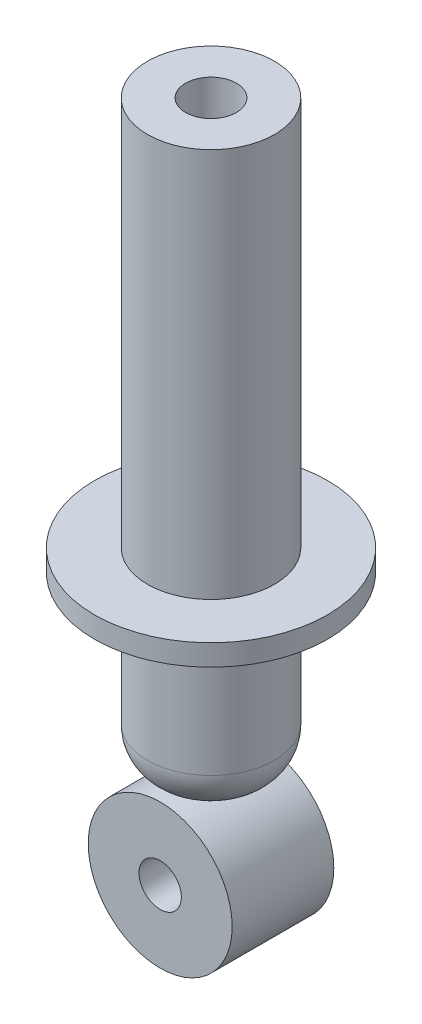
ISO-10303-21;
HEADER;
FILE_DESCRIPTION(('STEP AP214'),'2;1');
FILE_NAME('part.step','',(''),(''),'','','');
FILE_SCHEMA(('AUTOMOTIVE_DESIGN { 1 0 10303 214 1 1 1 1 }'));
ENDSEC;
DATA;
#1=APPLICATION_CONTEXT('core data for automotive mechanical design processes');
#2=APPLICATION_PROTOCOL_DEFINITION('international standard','automotive_design',2000,#1);
#3=PRODUCT_CONTEXT('',#1,'mechanical');
#4=PRODUCT('Part','Part','',(#3));
#5=PRODUCT_RELATED_PRODUCT_CATEGORY('part','',(#4));
#6=PRODUCT_DEFINITION_FORMATION('','',#4);
#7=PRODUCT_DEFINITION_CONTEXT('part definition',#1,'design');
#8=PRODUCT_DEFINITION('design','',#6,#7);
#9=PRODUCT_DEFINITION_SHAPE('','',#8);
#10=(LENGTH_UNIT() NAMED_UNIT(*) SI_UNIT(.MILLI.,.METRE.));
#11=(NAMED_UNIT(*) PLANE_ANGLE_UNIT() SI_UNIT($,.RADIAN.));
#12=(NAMED_UNIT(*) SI_UNIT($,.STERADIAN.) SOLID_ANGLE_UNIT());
#13=UNCERTAINTY_MEASURE_WITH_UNIT(LENGTH_MEASURE(1.E-05),#10,'distance_accuracy_value','');
#14=(GEOMETRIC_REPRESENTATION_CONTEXT(3) GLOBAL_UNCERTAINTY_ASSIGNED_CONTEXT((#13)) GLOBAL_UNIT_ASSIGNED_CONTEXT((#10,
#11,#12)) REPRESENTATION_CONTEXT('',''));
#15=CARTESIAN_POINT('',(0.,0.,0.));
#16=DIRECTION('',(0.,0.,1.));
#17=DIRECTION('',(1.,0.,0.));
#18=AXIS2_PLACEMENT_3D('',#15,#16,#17);
#19=CARTESIAN_POINT('',(0.,-17.,12.));
#20=DIRECTION('',(0.,0.,1.));
#21=DIRECTION('',(1.,0.,0.));
#22=AXIS2_PLACEMENT_3D('',#19,#20,#21);
#23=PLANE('',#22);
#24=CARTESIAN_POINT('',(0.,-17.,12.));
#25=DIRECTION('',(0.,0.,1.));
#26=DIRECTION('',(1.,0.,0.));
#27=AXIS2_PLACEMENT_3D('',#24,#25,#26);
#28=CIRCLE('',#27,17.);
#29=CARTESIAN_POINT('',(17.,-17.,12.));
#30=VERTEX_POINT('',#29);
#31=EDGE_CURVE('E13',#30,#30,#28,.T.);
#32=ORIENTED_EDGE('',*,*,#31,.T.);
#33=EDGE_LOOP('',(#32));
#34=FACE_BOUND('',#33,.T.);
#35=CARTESIAN_POINT('',(0.,-17.,12.));
#36=DIRECTION('',(0.,0.,1.));
#37=DIRECTION('',(1.,0.,0.));
#38=AXIS2_PLACEMENT_3D('',#35,#36,#37);
#39=CIRCLE('',#38,5.);
#40=CARTESIAN_POINT('',(5.,-17.,12.));
#41=VERTEX_POINT('',#40);
#42=EDGE_CURVE('E63',#41,#41,#39,.T.);
#43=ORIENTED_EDGE('',*,*,#42,.F.);
#44=EDGE_LOOP('',(#43));
#45=FACE_BOUND('',#44,.T.);
#46=ADVANCED_FACE('F52',(#34,#45),#23,.T.);
#47=CARTESIAN_POINT('',(0.,-17.,-12.));
#48=DIRECTION('',(0.,0.,1.));
#49=DIRECTION('',(1.,0.,0.));
#50=AXIS2_PLACEMENT_3D('',#47,#48,#49);
#51=PLANE('',#50);
#52=CARTESIAN_POINT('',(0.,-17.,-12.));
#53=DIRECTION('',(0.,0.,1.));
#54=DIRECTION('',(1.,0.,0.));
#55=AXIS2_PLACEMENT_3D('',#52,#53,#54);
#56=CIRCLE('',#55,17.);
#57=CARTESIAN_POINT('',(17.,-17.,-12.));
#58=VERTEX_POINT('',#57);
#59=EDGE_CURVE('E56',#58,#58,#56,.T.);
#60=ORIENTED_EDGE('',*,*,#59,.F.);
#61=EDGE_LOOP('',(#60));
#62=FACE_BOUND('',#61,.T.);
#63=CARTESIAN_POINT('',(0.,-17.,-12.));
#64=DIRECTION('',(0.,0.,1.));
#65=DIRECTION('',(1.,0.,0.));
#66=AXIS2_PLACEMENT_3D('',#63,#64,#65);
#67=CIRCLE('',#66,5.);
#68=CARTESIAN_POINT('',(5.,-17.,-12.));
#69=VERTEX_POINT('',#68);
#70=EDGE_CURVE('E65',#69,#69,#67,.T.);
#71=ORIENTED_EDGE('',*,*,#70,.T.);
#72=EDGE_LOOP('',(#71));
#73=FACE_BOUND('',#72,.T.);
#74=ADVANCED_FACE('F75',(#62,#73),#51,.F.);
#75=CARTESIAN_POINT('',(0.,-17.,12.));
#76=DIRECTION('',(0.,0.,-1.));
#77=DIRECTION('',(-1.,0.,0.));
#78=AXIS2_PLACEMENT_3D('',#75,#76,#77);
#79=CYLINDRICAL_SURFACE('',#78,17.);
#80=ORIENTED_EDGE('',*,*,#31,.F.);
#81=EDGE_LOOP('',(#80));
#82=FACE_BOUND('',#81,.T.);
#83=ORIENTED_EDGE('',*,*,#59,.T.);
#84=EDGE_LOOP('',(#83));
#85=FACE_BOUND('',#84,.T.);
#86=ADVANCED_FACE('F54',(#82,#85),#79,.T.);
#87=CARTESIAN_POINT('',(0.,-17.,12.));
#88=DIRECTION('',(0.,0.,-1.));
#89=DIRECTION('',(-1.,0.,0.));
#90=AXIS2_PLACEMENT_3D('',#87,#88,#89);
#91=CYLINDRICAL_SURFACE('',#90,5.);
#92=ORIENTED_EDGE('',*,*,#42,.T.);
#93=EDGE_LOOP('',(#92));
#94=FACE_BOUND('',#93,.T.);
#95=ORIENTED_EDGE('',*,*,#70,.F.);
#96=EDGE_LOOP('',(#95));
#97=FACE_BOUND('',#96,.T.);
#98=ADVANCED_FACE('F71',(#94,#97),#91,.F.);
#99=CLOSED_SHELL('',(#46,#74,#86,#98));
#100=MANIFOLD_SOLID_BREP('B2',#99);
#101=CARTESIAN_POINT('',(0.,136.,0.));
#102=DIRECTION('',(0.,-1.,0.));
#103=DIRECTION('',(0.,0.,-1.));
#104=AXIS2_PLACEMENT_3D('',#101,#102,#103);
#105=CYLINDRICAL_SURFACE('',#104,15.);
#106=CARTESIAN_POINT('',(0.,46.,0.));
#107=DIRECTION('',(0.,1.,0.));
#108=DIRECTION('',(0.,0.,1.));
#109=AXIS2_PLACEMENT_3D('',#106,#107,#108);
#110=CIRCLE('',#109,15.);
#111=CARTESIAN_POINT('',(0.,46.,15.));
#112=VERTEX_POINT('',#111);
#113=EDGE_CURVE('E149',#112,#112,#110,.T.);
#114=ORIENTED_EDGE('',*,*,#113,.T.);
#115=EDGE_LOOP('',(#114));
#116=FACE_BOUND('',#115,.T.);
#117=CARTESIAN_POINT('',(0.,138.,0.));
#118=DIRECTION('',(0.,1.,0.));
#119=DIRECTION('',(0.,0.,1.));
#120=AXIS2_PLACEMENT_3D('',#117,#118,#119);
#121=CIRCLE('',#120,15.);
#122=CARTESIAN_POINT('',(0.,138.,15.));
#123=VERTEX_POINT('',#122);
#124=EDGE_CURVE('E134',#123,#123,#121,.T.);
#125=ORIENTED_EDGE('',*,*,#124,.F.);
#126=EDGE_LOOP('',(#125));
#127=FACE_BOUND('',#126,.T.);
#128=ADVANCED_FACE('F119',(#116,#127),#105,.T.);
#129=CARTESIAN_POINT('',(0.,138.,0.));
#130=DIRECTION('',(0.,1.,0.));
#131=DIRECTION('',(0.,0.,1.));
#132=AXIS2_PLACEMENT_3D('',#129,#130,#131);
#133=PLANE('',#132);
#134=ORIENTED_EDGE('',*,*,#124,.T.);
#135=EDGE_LOOP('',(#134));
#136=FACE_BOUND('',#135,.T.);
#137=CARTESIAN_POINT('',(0.,138.,0.));
#138=DIRECTION('',(0.,1.,0.));
#139=DIRECTION('',(0.,0.,1.));
#140=AXIS2_PLACEMENT_3D('',#137,#138,#139);
#141=CIRCLE('',#140,6.);
#142=CARTESIAN_POINT('',(0.,138.,6.));
#143=VERTEX_POINT('',#142);
#144=EDGE_CURVE('E139',#143,#143,#141,.T.);
#145=ORIENTED_EDGE('',*,*,#144,.F.);
#146=EDGE_LOOP('',(#145));
#147=FACE_BOUND('',#146,.T.);
#148=ADVANCED_FACE('F174',(#136,#147),#133,.T.);
#149=CARTESIAN_POINT('',(0.,138.,0.));
#150=DIRECTION('',(0.,-1.,0.));
#151=DIRECTION('',(0.,0.,-1.));
#152=AXIS2_PLACEMENT_3D('',#149,#150,#151);
#153=CYLINDRICAL_SURFACE('',#152,6.);
#154=ORIENTED_EDGE('',*,*,#144,.T.);
#155=EDGE_LOOP('',(#154));
#156=FACE_BOUND('',#155,.T.);
#157=CARTESIAN_POINT('',(0.,5.99999999999992,0.));
#158=DIRECTION('',(0.,1.,0.));
#159=DIRECTION('',(0.,0.,1.));
#160=AXIS2_PLACEMENT_3D('',#157,#158,#159);
#161=CIRCLE('',#160,6.);
#162=CARTESIAN_POINT('',(0.,5.99999999999992,6.));
#163=VERTEX_POINT('',#162);
#164=EDGE_CURVE('E142',#163,#163,#161,.T.);
#165=ORIENTED_EDGE('',*,*,#164,.F.);
#166=EDGE_LOOP('',(#165));
#167=FACE_BOUND('',#166,.T.);
#168=ADVANCED_FACE('F170',(#156,#167),#153,.F.);
#169=CARTESIAN_POINT('',(0.,5.99999999999992,0.));
#170=DIRECTION('',(0.,1.,0.));
#171=DIRECTION('',(0.,0.,1.));
#172=AXIS2_PLACEMENT_3D('',#169,#170,#171);
#173=PLANE('',#172);
#174=ORIENTED_EDGE('',*,*,#164,.T.);
#175=EDGE_LOOP('',(#174));
#176=FACE_BOUND('',#175,.T.);
#177=ADVANCED_FACE('F160',(#176),#173,.T.);
#178=CARTESIAN_POINT('',(0.,46.,0.));
#179=DIRECTION('',(0.,1.,0.));
#180=DIRECTION('',(0.,0.,1.));
#181=AXIS2_PLACEMENT_3D('',#178,#179,#180);
#182=PLANE('',#181);
#183=CARTESIAN_POINT('',(0.,46.,0.));
#184=DIRECTION('',(0.,1.,0.));
#185=DIRECTION('',(0.,0.,1.));
#186=AXIS2_PLACEMENT_3D('',#183,#184,#185);
#187=CIRCLE('',#186,27.5);
#188=CARTESIAN_POINT('',(0.,46.,27.5));
#189=VERTEX_POINT('',#188);
#190=EDGE_CURVE('E145',#189,#189,#187,.T.);
#191=ORIENTED_EDGE('',*,*,#190,.T.);
#192=EDGE_LOOP('',(#191));
#193=FACE_BOUND('',#192,.T.);
#194=ORIENTED_EDGE('',*,*,#113,.F.);
#195=EDGE_LOOP('',(#194));
#196=FACE_BOUND('',#195,.T.);
#197=ADVANCED_FACE('F157',(#193,#196),#182,.T.);
#198=CARTESIAN_POINT('',(0.,41.,0.));
#199=DIRECTION('',(0.,1.,0.));
#200=DIRECTION('',(0.,0.,1.));
#201=AXIS2_PLACEMENT_3D('',#198,#199,#200);
#202=PLANE('',#201);
#203=CARTESIAN_POINT('',(0.,41.,0.));
#204=DIRECTION('',(0.,1.,0.));
#205=DIRECTION('',(0.,0.,1.));
#206=AXIS2_PLACEMENT_3D('',#203,#204,#205);
#207=CIRCLE('',#206,27.5);
#208=CARTESIAN_POINT('',(0.,41.,27.5));
#209=VERTEX_POINT('',#208);
#210=EDGE_CURVE('E146',#209,#209,#207,.T.);
#211=ORIENTED_EDGE('',*,*,#210,.F.);
#212=EDGE_LOOP('',(#211));
#213=FACE_BOUND('',#212,.T.);
#214=CARTESIAN_POINT('',(0.,41.,0.));
#215=DIRECTION('',(0.,1.,0.));
#216=DIRECTION('',(0.,0.,1.));
#217=AXIS2_PLACEMENT_3D('',#214,#215,#216);
#218=CIRCLE('',#217,15.);
#219=CARTESIAN_POINT('',(0.,41.,15.));
#220=VERTEX_POINT('',#219);
#221=EDGE_CURVE('E51',#220,#220,#218,.T.);
#222=ORIENTED_EDGE('',*,*,#221,.T.);
#223=EDGE_LOOP('',(#222));
#224=FACE_BOUND('',#223,.T.);
#225=ADVANCED_FACE('F159',(#213,#224),#202,.F.);
#226=CARTESIAN_POINT('',(0.,46.,0.));
#227=DIRECTION('',(0.,-1.,0.));
#228=DIRECTION('',(0.,0.,-1.));
#229=AXIS2_PLACEMENT_3D('',#226,#227,#228);
#230=CYLINDRICAL_SURFACE('',#229,27.5);
#231=ORIENTED_EDGE('',*,*,#190,.F.);
#232=EDGE_LOOP('',(#231));
#233=FACE_BOUND('',#232,.T.);
#234=ORIENTED_EDGE('',*,*,#210,.T.);
#235=EDGE_LOOP('',(#234));
#236=FACE_BOUND('',#235,.T.);
#237=ADVANCED_FACE('F167',(#233,#236),#230,.T.);
#238=CARTESIAN_POINT('',(0.,0.,0.));
#239=DIRECTION('',(0.,1.,0.));
#240=DIRECTION('',(0.,0.,1.));
#241=AXIS2_PLACEMENT_3D('',#238,#239,#240);
#242=PLANE('',#241);
#243=CARTESIAN_POINT('',(0.,0.,0.));
#244=DIRECTION('',(0.,1.,0.));
#245=DIRECTION('',(0.,0.,1.));
#246=AXIS2_PLACEMENT_3D('',#243,#244,#245);
#247=CIRCLE('',#246,5.);
#248=CARTESIAN_POINT('',(0.,0.,5.));
#249=VERTEX_POINT('',#248);
#250=EDGE_CURVE('E126',#249,#249,#247,.F.);
#251=ORIENTED_EDGE('',*,*,#250,.T.);
#252=EDGE_LOOP('',(#251));
#253=FACE_BOUND('',#252,.T.);
#254=ADVANCED_FACE('F187',(#253),#242,.F.);
#255=CARTESIAN_POINT('',(0.,10.,0.));
#256=DIRECTION('',(0.,1.,0.));
#257=DIRECTION('',(0.,0.,1.));
#258=AXIS2_PLACEMENT_3D('',#255,#256,#257);
#259=DEGENERATE_TOROIDAL_SURFACE('',#258,5.,10.,.T.);
#260=ORIENTED_EDGE('',*,*,#250,.F.);
#261=EDGE_LOOP('',(#260));
#262=FACE_BOUND('',#261,.T.);
#263=CARTESIAN_POINT('',(0.,10.,0.));
#264=DIRECTION('',(0.,1.,0.));
#265=DIRECTION('',(0.,0.,1.));
#266=AXIS2_PLACEMENT_3D('',#263,#264,#265);
#267=CIRCLE('',#266,15.);
#268=CARTESIAN_POINT('',(0.,10.,15.));
#269=VERTEX_POINT('',#268);
#270=EDGE_CURVE('E130',#269,#269,#267,.T.);
#271=ORIENTED_EDGE('',*,*,#270,.F.);
#272=EDGE_LOOP('',(#271));
#273=FACE_BOUND('',#272,.T.);
#274=ADVANCED_FACE('F121',(#262,#273),#259,.T.);
#275=ORIENTED_EDGE('',*,*,#270,.T.);
#276=EDGE_LOOP('',(#275));
#277=FACE_BOUND('',#276,.T.);
#278=ORIENTED_EDGE('',*,*,#221,.F.);
#279=EDGE_LOOP('',(#278));
#280=FACE_BOUND('',#279,.T.);
#281=ADVANCED_FACE('F175',(#277,#280),#105,.T.);
#282=CLOSED_SHELL('',(#128,#148,#168,#177,#197,#225,#237,#254,#274,#281));
#283=MANIFOLD_SOLID_BREP('B8',#282);
#284=ADVANCED_BREP_SHAPE_REPRESENTATION('',(#18,#100,#283),#14);
#285=SHAPE_DEFINITION_REPRESENTATION(#9,#284);
ENDSEC;
END-ISO-10303-21;
